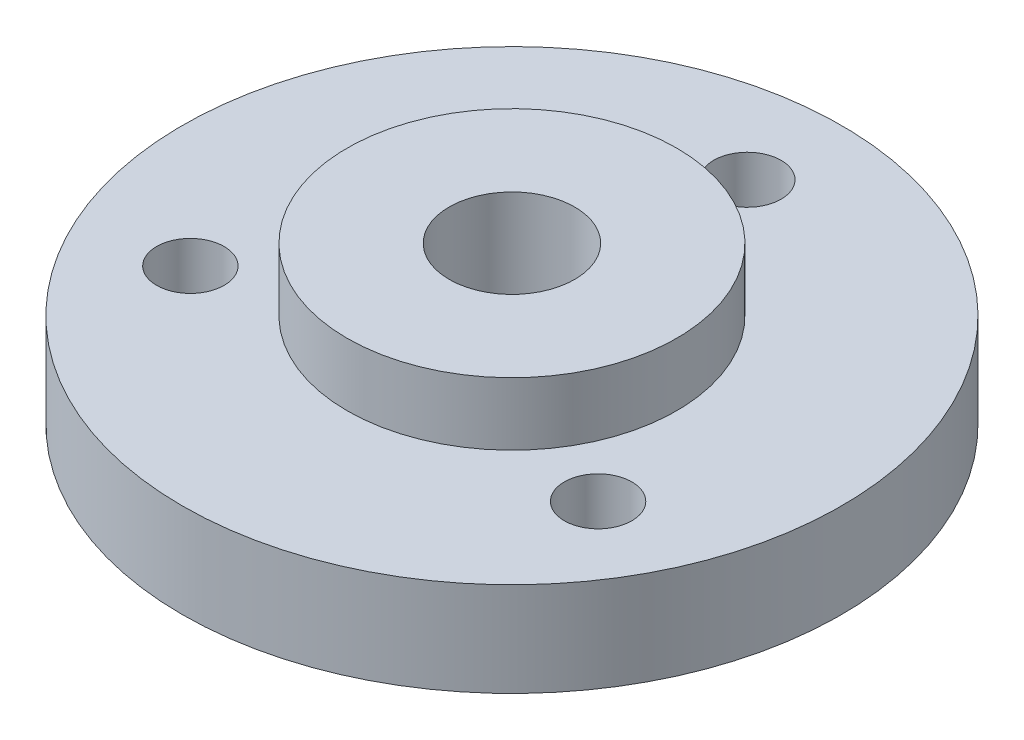
ISO-10303-21;
HEADER;
FILE_DESCRIPTION(('STEP AP214'),'2;1');
FILE_NAME('part.step','',(''),(''),'','','');
FILE_SCHEMA(('AUTOMOTIVE_DESIGN { 1 0 10303 214 1 1 1 1 }'));
ENDSEC;
DATA;
#1=APPLICATION_CONTEXT('core data for automotive mechanical design processes');
#2=APPLICATION_PROTOCOL_DEFINITION('international standard','automotive_design',2000,#1);
#3=PRODUCT_CONTEXT('',#1,'mechanical');
#4=PRODUCT('Part','Part','',(#3));
#5=PRODUCT_RELATED_PRODUCT_CATEGORY('part','',(#4));
#6=PRODUCT_DEFINITION_FORMATION('','',#4);
#7=PRODUCT_DEFINITION_CONTEXT('part definition',#1,'design');
#8=PRODUCT_DEFINITION('design','',#6,#7);
#9=PRODUCT_DEFINITION_SHAPE('','',#8);
#10=(LENGTH_UNIT() NAMED_UNIT(*) SI_UNIT(.MILLI.,.METRE.));
#11=(NAMED_UNIT(*) PLANE_ANGLE_UNIT() SI_UNIT($,.RADIAN.));
#12=(NAMED_UNIT(*) SI_UNIT($,.STERADIAN.) SOLID_ANGLE_UNIT());
#13=UNCERTAINTY_MEASURE_WITH_UNIT(LENGTH_MEASURE(1.E-05),#10,'distance_accuracy_value','');
#14=(GEOMETRIC_REPRESENTATION_CONTEXT(3) GLOBAL_UNCERTAINTY_ASSIGNED_CONTEXT((#13)) GLOBAL_UNIT_ASSIGNED_CONTEXT((#10,
#11,#12)) REPRESENTATION_CONTEXT('',''));
#15=CARTESIAN_POINT('',(0.,0.,0.));
#16=DIRECTION('',(0.,0.,1.));
#17=DIRECTION('',(1.,0.,0.));
#18=AXIS2_PLACEMENT_3D('',#15,#16,#17);
#19=CARTESIAN_POINT('',(0.,6.,0.));
#20=DIRECTION('',(0.,1.,0.));
#21=DIRECTION('',(0.,0.,1.));
#22=AXIS2_PLACEMENT_3D('',#19,#20,#21);
#23=PLANE('',#22);
#24=CARTESIAN_POINT('',(0.,6.,0.));
#25=DIRECTION('',(0.,1.,0.));
#26=DIRECTION('',(0.,0.,1.));
#27=AXIS2_PLACEMENT_3D('',#24,#25,#26);
#28=CIRCLE('',#27,10.5);
#29=CARTESIAN_POINT('',(0.,6.,10.5));
#30=VERTEX_POINT('',#29);
#31=EDGE_CURVE('E10',#30,#30,#28,.T.);
#32=ORIENTED_EDGE('',*,*,#31,.F.);
#33=EDGE_LOOP('',(#32));
#34=FACE_BOUND('',#33,.T.);
#35=CARTESIAN_POINT('',(12.9903810567672,6.,7.49999999999963));
#36=DIRECTION('',(0.,1.,0.));
#37=DIRECTION('',(0.,0.,1.));
#38=AXIS2_PLACEMENT_3D('',#35,#36,#37);
#39=CIRCLE('',#38,2.15000000000057);
#40=CARTESIAN_POINT('',(12.9903810567672,6.,9.6500000000002));
#41=VERTEX_POINT('',#40);
#42=EDGE_CURVE('E71',#41,#41,#39,.T.);
#43=ORIENTED_EDGE('',*,*,#42,.F.);
#44=EDGE_LOOP('',(#43));
#45=FACE_BOUND('',#44,.T.);
#46=CARTESIAN_POINT('',(0.,6.,0.));
#47=DIRECTION('',(0.,1.,0.));
#48=DIRECTION('',(0.,0.,1.));
#49=AXIS2_PLACEMENT_3D('',#46,#47,#48);
#50=CIRCLE('',#49,21.);
#51=CARTESIAN_POINT('',(0.,6.,21.));
#52=VERTEX_POINT('',#51);
#53=EDGE_CURVE('E52',#52,#52,#50,.T.);
#54=ORIENTED_EDGE('',*,*,#53,.T.);
#55=EDGE_LOOP('',(#54));
#56=FACE_BOUND('',#55,.T.);
#57=CARTESIAN_POINT('',(0.,6.,-15.));
#58=DIRECTION('',(0.,1.,0.));
#59=DIRECTION('',(0.,0.,1.));
#60=AXIS2_PLACEMENT_3D('',#57,#58,#59);
#61=CIRCLE('',#60,2.15);
#62=CARTESIAN_POINT('',(0.,6.,-12.85));
#63=VERTEX_POINT('',#62);
#64=EDGE_CURVE('E79',#63,#63,#61,.T.);
#65=ORIENTED_EDGE('',*,*,#64,.F.);
#66=EDGE_LOOP('',(#65));
#67=FACE_BOUND('',#66,.T.);
#68=CARTESIAN_POINT('',(-12.9903810567659,6.,7.50000000000036));
#69=DIRECTION('',(0.,1.,0.));
#70=DIRECTION('',(0.,0.,1.));
#71=AXIS2_PLACEMENT_3D('',#68,#69,#70);
#72=CIRCLE('',#71,2.15000000000085);
#73=CARTESIAN_POINT('',(-12.9903810567659,6.,9.65000000000121));
#74=VERTEX_POINT('',#73);
#75=EDGE_CURVE('E62',#74,#74,#72,.T.);
#76=ORIENTED_EDGE('',*,*,#75,.F.);
#77=EDGE_LOOP('',(#76));
#78=FACE_BOUND('',#77,.T.);
#79=ADVANCED_FACE('F43',(#34,#45,#56,#67,#78),#23,.T.);
#80=CARTESIAN_POINT('',(0.,0.,0.));
#81=DIRECTION('',(0.,1.,0.));
#82=DIRECTION('',(0.,0.,1.));
#83=AXIS2_PLACEMENT_3D('',#80,#81,#82);
#84=PLANE('',#83);
#85=CARTESIAN_POINT('',(0.,0.,0.));
#86=DIRECTION('',(0.,1.,0.));
#87=DIRECTION('',(0.,0.,1.));
#88=AXIS2_PLACEMENT_3D('',#85,#86,#87);
#89=CIRCLE('',#88,21.);
#90=CARTESIAN_POINT('',(0.,0.,21.));
#91=VERTEX_POINT('',#90);
#92=EDGE_CURVE('E47',#91,#91,#89,.T.);
#93=ORIENTED_EDGE('',*,*,#92,.F.);
#94=EDGE_LOOP('',(#93));
#95=FACE_BOUND('',#94,.T.);
#96=CARTESIAN_POINT('',(0.,0.,0.));
#97=DIRECTION('',(0.,1.,0.));
#98=DIRECTION('',(0.,0.,1.));
#99=AXIS2_PLACEMENT_3D('',#96,#97,#98);
#100=CIRCLE('',#99,4.);
#101=CARTESIAN_POINT('',(0.,0.,4.));
#102=VERTEX_POINT('',#101);
#103=EDGE_CURVE('E83',#102,#102,#100,.T.);
#104=ORIENTED_EDGE('',*,*,#103,.T.);
#105=EDGE_LOOP('',(#104));
#106=FACE_BOUND('',#105,.T.);
#107=CARTESIAN_POINT('',(0.,0.,-15.));
#108=DIRECTION('',(0.,1.,0.));
#109=DIRECTION('',(0.,0.,1.));
#110=AXIS2_PLACEMENT_3D('',#107,#108,#109);
#111=CIRCLE('',#110,2.15);
#112=CARTESIAN_POINT('',(0.,0.,-12.85));
#113=VERTEX_POINT('',#112);
#114=EDGE_CURVE('E75',#113,#113,#111,.T.);
#115=ORIENTED_EDGE('',*,*,#114,.T.);
#116=EDGE_LOOP('',(#115));
#117=FACE_BOUND('',#116,.T.);
#118=CARTESIAN_POINT('',(12.9903810567672,0.,7.49999999999963));
#119=DIRECTION('',(0.,1.,0.));
#120=DIRECTION('',(0.,0.,1.));
#121=AXIS2_PLACEMENT_3D('',#118,#119,#120);
#122=CIRCLE('',#121,2.15000000000057);
#123=CARTESIAN_POINT('',(12.9903810567672,0.,9.6500000000002));
#124=VERTEX_POINT('',#123);
#125=EDGE_CURVE('E66',#124,#124,#122,.T.);
#126=ORIENTED_EDGE('',*,*,#125,.T.);
#127=EDGE_LOOP('',(#126));
#128=FACE_BOUND('',#127,.T.);
#129=CARTESIAN_POINT('',(-12.9903810567659,0.,7.50000000000036));
#130=DIRECTION('',(0.,1.,0.));
#131=DIRECTION('',(0.,0.,1.));
#132=AXIS2_PLACEMENT_3D('',#129,#130,#131);
#133=CIRCLE('',#132,2.15000000000085);
#134=CARTESIAN_POINT('',(-12.9903810567659,0.,9.65000000000121));
#135=VERTEX_POINT('',#134);
#136=EDGE_CURVE('E67',#135,#135,#133,.T.);
#137=ORIENTED_EDGE('',*,*,#136,.T.);
#138=EDGE_LOOP('',(#137));
#139=FACE_BOUND('',#138,.T.);
#140=ADVANCED_FACE('F96',(#95,#106,#117,#128,#139),#84,.F.);
#141=CARTESIAN_POINT('',(0.,6.,0.));
#142=DIRECTION('',(0.,-1.,0.));
#143=DIRECTION('',(0.,0.,-1.));
#144=AXIS2_PLACEMENT_3D('',#141,#142,#143);
#145=CYLINDRICAL_SURFACE('',#144,21.);
#146=ORIENTED_EDGE('',*,*,#53,.F.);
#147=EDGE_LOOP('',(#146));
#148=FACE_BOUND('',#147,.T.);
#149=ORIENTED_EDGE('',*,*,#92,.T.);
#150=EDGE_LOOP('',(#149));
#151=FACE_BOUND('',#150,.T.);
#152=ADVANCED_FACE('F45',(#148,#151),#145,.T.);
#153=CARTESIAN_POINT('',(0.,6.,0.));
#154=DIRECTION('',(0.,-1.,0.));
#155=DIRECTION('',(0.,0.,-1.));
#156=AXIS2_PLACEMENT_3D('',#153,#154,#155);
#157=CYLINDRICAL_SURFACE('',#156,4.);
#158=ORIENTED_EDGE('',*,*,#103,.F.);
#159=EDGE_LOOP('',(#158));
#160=FACE_BOUND('',#159,.T.);
#161=CARTESIAN_POINT('',(0.,10.,0.));
#162=DIRECTION('',(0.,1.,0.));
#163=DIRECTION('',(0.,0.,1.));
#164=AXIS2_PLACEMENT_3D('',#161,#162,#163);
#165=CIRCLE('',#164,4.);
#166=CARTESIAN_POINT('',(0.,10.,4.));
#167=VERTEX_POINT('',#166);
#168=EDGE_CURVE('E183',#167,#167,#165,.T.);
#169=ORIENTED_EDGE('',*,*,#168,.T.);
#170=EDGE_LOOP('',(#169));
#171=FACE_BOUND('',#170,.T.);
#172=ADVANCED_FACE('F130',(#160,#171),#157,.F.);
#173=CARTESIAN_POINT('',(0.,6.,-15.));
#174=DIRECTION('',(0.,-1.,0.));
#175=DIRECTION('',(0.,0.,-1.));
#176=AXIS2_PLACEMENT_3D('',#173,#174,#175);
#177=CYLINDRICAL_SURFACE('',#176,2.15);
#178=ORIENTED_EDGE('',*,*,#64,.T.);
#179=EDGE_LOOP('',(#178));
#180=FACE_BOUND('',#179,.T.);
#181=ORIENTED_EDGE('',*,*,#114,.F.);
#182=EDGE_LOOP('',(#181));
#183=FACE_BOUND('',#182,.T.);
#184=ADVANCED_FACE('F119',(#180,#183),#177,.F.);
#185=CARTESIAN_POINT('',(12.9903810567672,6.,7.49999999999963));
#186=DIRECTION('',(0.,-1.,0.));
#187=DIRECTION('',(0.,0.,-1.));
#188=AXIS2_PLACEMENT_3D('',#185,#186,#187);
#189=CYLINDRICAL_SURFACE('',#188,2.15000000000057);
#190=ORIENTED_EDGE('',*,*,#42,.T.);
#191=EDGE_LOOP('',(#190));
#192=FACE_BOUND('',#191,.T.);
#193=ORIENTED_EDGE('',*,*,#125,.F.);
#194=EDGE_LOOP('',(#193));
#195=FACE_BOUND('',#194,.T.);
#196=ADVANCED_FACE('F108',(#192,#195),#189,.F.);
#197=CARTESIAN_POINT('',(-12.9903810567659,6.,7.50000000000036));
#198=DIRECTION('',(0.,-1.,0.));
#199=DIRECTION('',(0.,0.,-1.));
#200=AXIS2_PLACEMENT_3D('',#197,#198,#199);
#201=CYLINDRICAL_SURFACE('',#200,2.15000000000085);
#202=ORIENTED_EDGE('',*,*,#75,.T.);
#203=EDGE_LOOP('',(#202));
#204=FACE_BOUND('',#203,.T.);
#205=ORIENTED_EDGE('',*,*,#136,.F.);
#206=EDGE_LOOP('',(#205));
#207=FACE_BOUND('',#206,.T.);
#208=ADVANCED_FACE('F105',(#204,#207),#201,.F.);
#209=CARTESIAN_POINT('',(0.,10.,0.));
#210=DIRECTION('',(0.,1.,0.));
#211=DIRECTION('',(0.,0.,1.));
#212=AXIS2_PLACEMENT_3D('',#209,#210,#211);
#213=PLANE('',#212);
#214=CARTESIAN_POINT('',(0.,10.,0.));
#215=DIRECTION('',(0.,1.,0.));
#216=DIRECTION('',(0.,0.,1.));
#217=AXIS2_PLACEMENT_3D('',#214,#215,#216);
#218=CIRCLE('',#217,10.5);
#219=CARTESIAN_POINT('',(0.,10.,10.5));
#220=VERTEX_POINT('',#219);
#221=EDGE_CURVE('E60',#220,#220,#218,.T.);
#222=ORIENTED_EDGE('',*,*,#221,.T.);
#223=EDGE_LOOP('',(#222));
#224=FACE_BOUND('',#223,.T.);
#225=ORIENTED_EDGE('',*,*,#168,.F.);
#226=EDGE_LOOP('',(#225));
#227=FACE_BOUND('',#226,.T.);
#228=ADVANCED_FACE('F107',(#224,#227),#213,.T.);
#229=CARTESIAN_POINT('',(0.,10.,0.));
#230=DIRECTION('',(0.,-1.,0.));
#231=DIRECTION('',(0.,0.,-1.));
#232=AXIS2_PLACEMENT_3D('',#229,#230,#231);
#233=CYLINDRICAL_SURFACE('',#232,10.5);
#234=ORIENTED_EDGE('',*,*,#221,.F.);
#235=EDGE_LOOP('',(#234));
#236=FACE_BOUND('',#235,.T.);
#237=ORIENTED_EDGE('',*,*,#31,.T.);
#238=EDGE_LOOP('',(#237));
#239=FACE_BOUND('',#238,.T.);
#240=ADVANCED_FACE('F116',(#236,#239),#233,.T.);
#241=CLOSED_SHELL('',(#79,#140,#152,#172,#184,#196,#208,#228,#240));
#242=MANIFOLD_SOLID_BREP('B2',#241);
#243=ADVANCED_BREP_SHAPE_REPRESENTATION('',(#18,#242),#14);
#244=SHAPE_DEFINITION_REPRESENTATION(#9,#243);
ENDSEC;
END-ISO-10303-21;
